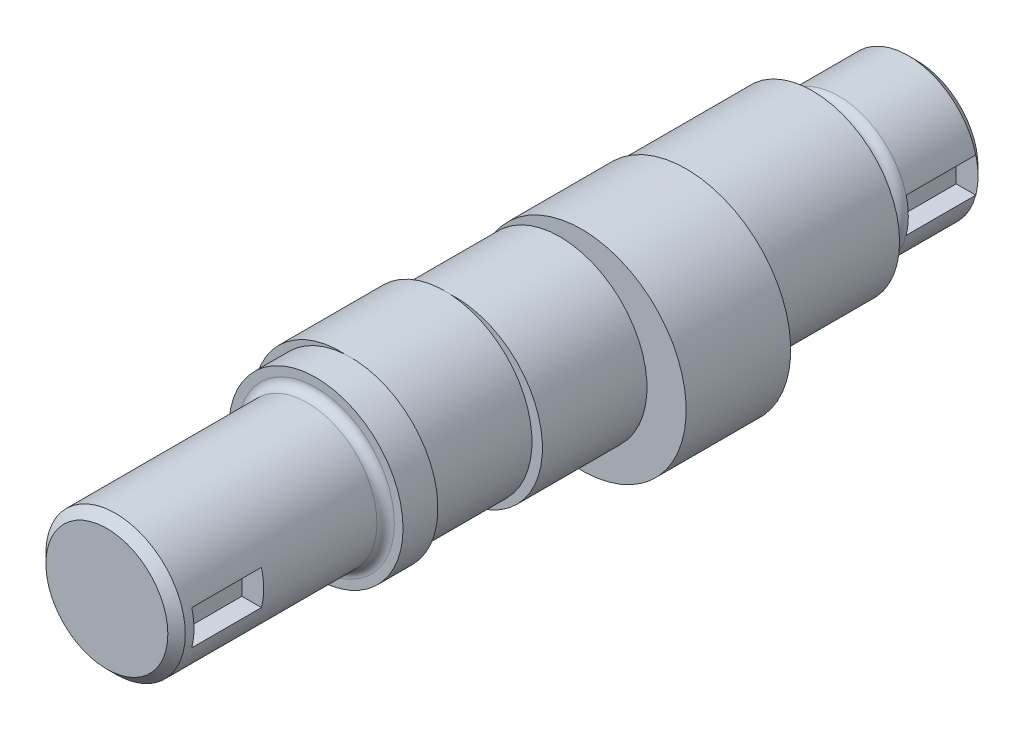
ISO-10303-21;
HEADER;
FILE_DESCRIPTION(('STEP AP214'),'2;1');
FILE_NAME('part.step','',(''),(''),'','','');
FILE_SCHEMA(('AUTOMOTIVE_DESIGN { 1 0 10303 214 1 1 1 1 }'));
ENDSEC;
DATA;
#1=APPLICATION_CONTEXT('core data for automotive mechanical design processes');
#2=APPLICATION_PROTOCOL_DEFINITION('international standard','automotive_design',2000,#1);
#3=PRODUCT_CONTEXT('',#1,'mechanical');
#4=PRODUCT('Part','Part','',(#3));
#5=PRODUCT_RELATED_PRODUCT_CATEGORY('part','',(#4));
#6=PRODUCT_DEFINITION_FORMATION('','',#4);
#7=PRODUCT_DEFINITION_CONTEXT('part definition',#1,'design');
#8=PRODUCT_DEFINITION('design','',#6,#7);
#9=PRODUCT_DEFINITION_SHAPE('','',#8);
#10=(LENGTH_UNIT() NAMED_UNIT(*) SI_UNIT(.MILLI.,.METRE.));
#11=(NAMED_UNIT(*) PLANE_ANGLE_UNIT() SI_UNIT($,.RADIAN.));
#12=(NAMED_UNIT(*) SI_UNIT($,.STERADIAN.) SOLID_ANGLE_UNIT());
#13=UNCERTAINTY_MEASURE_WITH_UNIT(LENGTH_MEASURE(1.E-05),#10,'distance_accuracy_value','');
#14=(GEOMETRIC_REPRESENTATION_CONTEXT(3) GLOBAL_UNCERTAINTY_ASSIGNED_CONTEXT((#13)) GLOBAL_UNIT_ASSIGNED_CONTEXT((#10,
#11,#12)) REPRESENTATION_CONTEXT('',''));
#15=CARTESIAN_POINT('',(0.,0.,0.));
#16=DIRECTION('',(0.,0.,1.));
#17=DIRECTION('',(1.,0.,0.));
#18=AXIS2_PLACEMENT_3D('',#15,#16,#17);
#19=CARTESIAN_POINT('',(0.,0.,80.));
#20=DIRECTION('',(0.,0.,-1.));
#21=DIRECTION('',(-1.,0.,0.));
#22=AXIS2_PLACEMENT_3D('',#19,#20,#21);
#23=CYLINDRICAL_SURFACE('',#22,8.);
#24=CARTESIAN_POINT('',(0.,0.,57.));
#25=DIRECTION('',(0.,0.,1.));
#26=DIRECTION('',(1.,0.,0.));
#27=AXIS2_PLACEMENT_3D('',#24,#25,#26);
#28=CIRCLE('',#27,8.);
#29=CARTESIAN_POINT('',(8.,0.,57.));
#30=VERTEX_POINT('',#29);
#31=EDGE_CURVE('E248',#30,#30,#28,.T.);
#32=ORIENTED_EDGE('',*,*,#31,.T.);
#33=EDGE_LOOP('',(#32));
#34=FACE_BOUND('',#33,.T.);
#35=CARTESIAN_POINT('',(0.,0.,79.));
#36=DIRECTION('',(0.,0.,1.));
#37=DIRECTION('',(1.,0.,0.));
#38=AXIS2_PLACEMENT_3D('',#35,#36,#37);
#39=CIRCLE('',#38,8.);
#40=CARTESIAN_POINT('',(8.,0.,79.));
#41=VERTEX_POINT('',#40);
#42=EDGE_CURVE('E240',#41,#41,#39,.F.);
#43=ORIENTED_EDGE('',*,*,#42,.T.);
#44=EDGE_LOOP('',(#43));
#45=FACE_BOUND('',#44,.T.);
#46=CARTESIAN_POINT('',(0.,0.,78.));
#47=DIRECTION('',(0.,0.,-1.));
#48=DIRECTION('',(-1.,0.,0.));
#49=AXIS2_PLACEMENT_3D('',#46,#47,#48);
#50=CIRCLE('',#49,8.);
#51=CARTESIAN_POINT('',(7.74596669241483,2.,78.));
#52=VERTEX_POINT('',#51);
#53=CARTESIAN_POINT('',(7.74596669241483,-2.,78.));
#54=VERTEX_POINT('',#53);
#55=EDGE_CURVE('E138',#52,#54,#50,.T.);
#56=ORIENTED_EDGE('',*,*,#55,.F.);
#57=DIRECTION('',(0.,0.,-1.));
#58=VECTOR('',#57,1.);
#59=CARTESIAN_POINT('',(7.74596669241483,2.,80.));
#60=LINE('',#59,#58);
#61=CARTESIAN_POINT('',(7.74596669241483,2.,70.));
#62=VERTEX_POINT('',#61);
#63=EDGE_CURVE('E232',#62,#52,#60,.F.);
#64=ORIENTED_EDGE('',*,*,#63,.F.);
#65=CARTESIAN_POINT('',(0.,0.,70.));
#66=DIRECTION('',(0.,0.,-1.));
#67=DIRECTION('',(-1.,0.,0.));
#68=AXIS2_PLACEMENT_3D('',#65,#66,#67);
#69=CIRCLE('',#68,8.);
#70=CARTESIAN_POINT('',(7.74596669241483,-2.,70.));
#71=VERTEX_POINT('',#70);
#72=EDGE_CURVE('E229',#62,#71,#69,.T.);
#73=ORIENTED_EDGE('',*,*,#72,.T.);
#74=DIRECTION('',(0.,0.,-1.));
#75=VECTOR('',#74,1.);
#76=CARTESIAN_POINT('',(7.74596669241483,-2.,80.));
#77=LINE('',#76,#75);
#78=EDGE_CURVE('E234',#54,#71,#77,.T.);
#79=ORIENTED_EDGE('',*,*,#78,.F.);
#80=EDGE_LOOP('',(#56,#64,#73,#79));
#81=FACE_BOUND('',#80,.T.);
#82=ADVANCED_FACE('F43',(#34,#45,#81),#23,.T.);
#83=CARTESIAN_POINT('',(0.,0.,-3.));
#84=DIRECTION('',(0.,0.,-1.));
#85=DIRECTION('',(-1.,0.,0.));
#86=AXIS2_PLACEMENT_3D('',#83,#84,#85);
#87=CYLINDRICAL_SURFACE('',#86,8.);
#88=DIRECTION('',(0.,0.,-1.));
#89=VECTOR('',#88,1.);
#90=CARTESIAN_POINT('',(7.74596669241483,-2.,-3.));
#91=LINE('',#90,#89);
#92=CARTESIAN_POINT('',(7.74596669241483,-2.,-4.));
#93=VERTEX_POINT('',#92);
#94=CARTESIAN_POINT('',(7.74596669241483,-2.,-12.));
#95=VERTEX_POINT('',#94);
#96=EDGE_CURVE('E224',#93,#95,#91,.T.);
#97=ORIENTED_EDGE('',*,*,#96,.F.);
#98=CARTESIAN_POINT('',(0.,0.,-4.));
#99=DIRECTION('',(0.,0.,1.));
#100=DIRECTION('',(1.,0.,0.));
#101=AXIS2_PLACEMENT_3D('',#98,#99,#100);
#102=CIRCLE('',#101,8.);
#103=CARTESIAN_POINT('',(7.74596669241483,2.,-4.));
#104=VERTEX_POINT('',#103);
#105=EDGE_CURVE('E257',#93,#104,#102,.F.);
#106=ORIENTED_EDGE('',*,*,#105,.T.);
#107=DIRECTION('',(0.,0.,-1.));
#108=VECTOR('',#107,1.);
#109=CARTESIAN_POINT('',(7.74596669241483,2.,-3.));
#110=LINE('',#109,#108);
#111=CARTESIAN_POINT('',(7.74596669241483,2.,-12.));
#112=VERTEX_POINT('',#111);
#113=EDGE_CURVE('E221',#112,#104,#110,.F.);
#114=ORIENTED_EDGE('',*,*,#113,.F.);
#115=CARTESIAN_POINT('',(0.,0.,-12.));
#116=DIRECTION('',(0.,0.,1.));
#117=DIRECTION('',(1.,0.,0.));
#118=AXIS2_PLACEMENT_3D('',#115,#116,#117);
#119=CIRCLE('',#118,8.);
#120=EDGE_CURVE('E243',#112,#95,#119,.T.);
#121=ORIENTED_EDGE('',*,*,#120,.T.);
#122=EDGE_LOOP('',(#97,#106,#114,#121));
#123=FACE_BOUND('',#122,.T.);
#124=ADVANCED_FACE('F275',(#123),#87,.T.);
#125=CARTESIAN_POINT('',(0.,0.,-3.));
#126=DIRECTION('',(0.,0.,1.));
#127=DIRECTION('',(1.,0.,0.));
#128=AXIS2_PLACEMENT_3D('',#125,#126,#127);
#129=PLANE('',#128);
#130=CARTESIAN_POINT('',(0.,0.,-3.));
#131=DIRECTION('',(0.,0.,1.));
#132=DIRECTION('',(1.,0.,0.));
#133=AXIS2_PLACEMENT_3D('',#130,#131,#132);
#134=CIRCLE('',#133,7.);
#135=CARTESIAN_POINT('',(7.,0.,-3.));
#136=VERTEX_POINT('',#135);
#137=EDGE_CURVE('E254',#136,#136,#134,.T.);
#138=ORIENTED_EDGE('',*,*,#137,.T.);
#139=EDGE_LOOP('',(#138));
#140=FACE_BOUND('',#139,.T.);
#141=CARTESIAN_POINT('',(0.,0.,-3.));
#142=DIRECTION('',(0.,0.,1.));
#143=DIRECTION('',(1.,0.,0.));
#144=AXIS2_PLACEMENT_3D('',#141,#142,#143);
#145=CIRCLE('',#144,6.5);
#146=CARTESIAN_POINT('',(6.5,0.,-3.));
#147=VERTEX_POINT('',#146);
#148=EDGE_CURVE('E214',#147,#147,#145,.T.);
#149=ORIENTED_EDGE('',*,*,#148,.F.);
#150=EDGE_LOOP('',(#149));
#151=FACE_BOUND('',#150,.T.);
#152=ADVANCED_FACE('F282',(#140,#151),#129,.T.);
#153=CARTESIAN_POINT('',(0.,0.,-13.));
#154=DIRECTION('',(0.,0.,1.));
#155=DIRECTION('',(1.,0.,0.));
#156=AXIS2_PLACEMENT_3D('',#153,#154,#155);
#157=PLANE('',#156);
#158=CARTESIAN_POINT('',(0.,0.,-13.));
#159=DIRECTION('',(0.,0.,1.));
#160=DIRECTION('',(1.,0.,0.));
#161=AXIS2_PLACEMENT_3D('',#158,#159,#160);
#162=CIRCLE('',#161,7.00000000000001);
#163=CARTESIAN_POINT('',(7.00000000000001,0.,-13.));
#164=VERTEX_POINT('',#163);
#165=EDGE_CURVE('E245',#164,#164,#162,.F.);
#166=ORIENTED_EDGE('',*,*,#165,.T.);
#167=EDGE_LOOP('',(#166));
#168=FACE_BOUND('',#167,.T.);
#169=ADVANCED_FACE('F351',(#168),#157,.F.);
#170=CARTESIAN_POINT('',(0.,0.,-1.));
#171=DIRECTION('',(0.,0.,-1.));
#172=DIRECTION('',(-1.,0.,0.));
#173=AXIS2_PLACEMENT_3D('',#170,#171,#172);
#174=CYLINDRICAL_SURFACE('',#173,6.5);
#175=CARTESIAN_POINT('',(0.,0.,-2.));
#176=DIRECTION('',(0.,0.,1.));
#177=DIRECTION('',(1.,0.,0.));
#178=AXIS2_PLACEMENT_3D('',#175,#176,#177);
#179=CIRCLE('',#178,6.5);
#180=CARTESIAN_POINT('',(6.5,0.,-2.));
#181=VERTEX_POINT('',#180);
#182=EDGE_CURVE('E11',#181,#181,#179,.F.);
#183=ORIENTED_EDGE('',*,*,#182,.T.);
#184=EDGE_LOOP('',(#183));
#185=FACE_BOUND('',#184,.T.);
#186=ORIENTED_EDGE('',*,*,#148,.T.);
#187=EDGE_LOOP('',(#186));
#188=FACE_BOUND('',#187,.T.);
#189=ADVANCED_FACE('F347',(#185,#188),#174,.T.);
#190=CARTESIAN_POINT('',(0.,0.,16.));
#191=DIRECTION('',(0.,0.,-1.));
#192=DIRECTION('',(-1.,0.,0.));
#193=AXIS2_PLACEMENT_3D('',#190,#191,#192);
#194=CYLINDRICAL_SURFACE('',#193,10.);
#195=CARTESIAN_POINT('',(0.,0.,16.));
#196=DIRECTION('',(0.,0.,1.));
#197=DIRECTION('',(1.,0.,0.));
#198=AXIS2_PLACEMENT_3D('',#195,#196,#197);
#199=CIRCLE('',#198,10.);
#200=CARTESIAN_POINT('',(-7.55,6.55724789831832,16.));
#201=VERTEX_POINT('',#200);
#202=CARTESIAN_POINT('',(-7.55,-6.55724789831832,16.));
#203=VERTEX_POINT('',#202);
#204=EDGE_CURVE('E212',#201,#203,#199,.T.);
#205=ORIENTED_EDGE('',*,*,#204,.F.);
#206=EDGE_CURVE('E215',#203,#201,#199,.T.);
#207=ORIENTED_EDGE('',*,*,#206,.F.);
#208=EDGE_LOOP('',(#205,#207));
#209=FACE_BOUND('',#208,.T.);
#210=CARTESIAN_POINT('',(0.,0.,-1.));
#211=DIRECTION('',(0.,0.,1.));
#212=DIRECTION('',(1.,0.,0.));
#213=AXIS2_PLACEMENT_3D('',#210,#211,#212);
#214=CIRCLE('',#213,10.);
#215=CARTESIAN_POINT('',(10.,0.,-1.));
#216=VERTEX_POINT('',#215);
#217=EDGE_CURVE('E207',#216,#216,#214,.T.);
#218=ORIENTED_EDGE('',*,*,#217,.T.);
#219=EDGE_LOOP('',(#218));
#220=FACE_BOUND('',#219,.T.);
#221=ADVANCED_FACE('F341',(#209,#220),#194,.T.);
#222=CARTESIAN_POINT('',(0.,0.,16.));
#223=DIRECTION('',(0.,0.,1.));
#224=DIRECTION('',(1.,0.,0.));
#225=AXIS2_PLACEMENT_3D('',#222,#223,#224);
#226=PLANE('',#225);
#227=CARTESIAN_POINT('',(2.5,0.,16.));
#228=DIRECTION('',(0.,0.,1.));
#229=DIRECTION('',(1.,0.,0.));
#230=AXIS2_PLACEMENT_3D('',#227,#228,#229);
#231=CIRCLE('',#230,12.);
#232=EDGE_CURVE('E209',#201,#203,#231,.T.);
#233=ORIENTED_EDGE('',*,*,#232,.F.);
#234=ORIENTED_EDGE('',*,*,#204,.T.);
#235=EDGE_LOOP('',(#233,#234));
#236=FACE_BOUND('',#235,.T.);
#237=ADVANCED_FACE('F338',(#236),#226,.T.);
#238=CARTESIAN_POINT('',(0.,0.,-1.));
#239=DIRECTION('',(0.,0.,1.));
#240=DIRECTION('',(1.,0.,0.));
#241=AXIS2_PLACEMENT_3D('',#238,#239,#240);
#242=PLANE('',#241);
#243=CARTESIAN_POINT('',(0.,0.,-1.));
#244=DIRECTION('',(0.,0.,1.));
#245=DIRECTION('',(1.,0.,0.));
#246=AXIS2_PLACEMENT_3D('',#243,#244,#245);
#247=CIRCLE('',#246,7.5);
#248=CARTESIAN_POINT('',(7.5,0.,-1.));
#249=VERTEX_POINT('',#248);
#250=EDGE_CURVE('E51',#249,#249,#247,.T.);
#251=ORIENTED_EDGE('',*,*,#250,.T.);
#252=EDGE_LOOP('',(#251));
#253=FACE_BOUND('',#252,.T.);
#254=ORIENTED_EDGE('',*,*,#217,.F.);
#255=EDGE_LOOP('',(#254));
#256=FACE_BOUND('',#255,.T.);
#257=ADVANCED_FACE('F262',(#253,#256),#242,.F.);
#258=CARTESIAN_POINT('',(2.5,0.,16.));
#259=DIRECTION('',(0.,0.,1.));
#260=DIRECTION('',(1.,0.,0.));
#261=AXIS2_PLACEMENT_3D('',#258,#259,#260);
#262=PLANE('',#261);
#263=EDGE_CURVE('E199',#203,#201,#231,.T.);
#264=ORIENTED_EDGE('',*,*,#263,.F.);
#265=ORIENTED_EDGE('',*,*,#206,.T.);
#266=EDGE_LOOP('',(#264,#265));
#267=FACE_BOUND('',#266,.T.);
#268=ADVANCED_FACE('F331',(#267),#262,.F.);
#269=CARTESIAN_POINT('',(2.5,0.,28.));
#270=DIRECTION('',(0.,0.,-1.));
#271=DIRECTION('',(-1.,0.,0.));
#272=AXIS2_PLACEMENT_3D('',#269,#270,#271);
#273=CYLINDRICAL_SURFACE('',#272,12.);
#274=CARTESIAN_POINT('',(2.5,0.,28.));
#275=DIRECTION('',(0.,0.,1.));
#276=DIRECTION('',(1.,0.,0.));
#277=AXIS2_PLACEMENT_3D('',#274,#275,#276);
#278=CIRCLE('',#277,12.);
#279=CARTESIAN_POINT('',(-7.55,6.55724789831832,28.));
#280=VERTEX_POINT('',#279);
#281=CARTESIAN_POINT('',(-7.55,-6.55724789831832,28.));
#282=VERTEX_POINT('',#281);
#283=EDGE_CURVE('E204',#280,#282,#278,.T.);
#284=ORIENTED_EDGE('',*,*,#283,.F.);
#285=EDGE_CURVE('E208',#282,#280,#278,.T.);
#286=ORIENTED_EDGE('',*,*,#285,.F.);
#287=EDGE_LOOP('',(#284,#286));
#288=FACE_BOUND('',#287,.T.);
#289=ORIENTED_EDGE('',*,*,#232,.T.);
#290=ORIENTED_EDGE('',*,*,#263,.T.);
#291=EDGE_LOOP('',(#289,#290));
#292=FACE_BOUND('',#291,.T.);
#293=ADVANCED_FACE('F329',(#288,#292),#273,.T.);
#294=CARTESIAN_POINT('',(2.5,0.,28.));
#295=DIRECTION('',(0.,0.,1.));
#296=DIRECTION('',(1.,0.,0.));
#297=AXIS2_PLACEMENT_3D('',#294,#295,#296);
#298=PLANE('',#297);
#299=CARTESIAN_POINT('',(0.,0.,28.));
#300=DIRECTION('',(0.,0.,1.));
#301=DIRECTION('',(1.,0.,0.));
#302=AXIS2_PLACEMENT_3D('',#299,#300,#301);
#303=CIRCLE('',#302,10.);
#304=EDGE_CURVE('E203',#282,#280,#303,.T.);
#305=ORIENTED_EDGE('',*,*,#304,.F.);
#306=ORIENTED_EDGE('',*,*,#285,.T.);
#307=EDGE_LOOP('',(#305,#306));
#308=FACE_BOUND('',#307,.T.);
#309=ADVANCED_FACE('F322',(#308),#298,.T.);
#310=CARTESIAN_POINT('',(0.,0.,28.));
#311=DIRECTION('',(0.,0.,1.));
#312=DIRECTION('',(1.,0.,0.));
#313=AXIS2_PLACEMENT_3D('',#310,#311,#312);
#314=PLANE('',#313);
#315=EDGE_CURVE('E191',#280,#282,#303,.T.);
#316=ORIENTED_EDGE('',*,*,#315,.F.);
#317=ORIENTED_EDGE('',*,*,#283,.T.);
#318=EDGE_LOOP('',(#316,#317));
#319=FACE_BOUND('',#318,.T.);
#320=ADVANCED_FACE('F319',(#319),#314,.F.);
#321=CARTESIAN_POINT('',(0.,0.,40.));
#322=DIRECTION('',(0.,0.,-1.));
#323=DIRECTION('',(-1.,0.,0.));
#324=AXIS2_PLACEMENT_3D('',#321,#322,#323);
#325=CYLINDRICAL_SURFACE('',#324,10.);
#326=CARTESIAN_POINT('',(0.,0.,40.));
#327=DIRECTION('',(0.,0.,1.));
#328=DIRECTION('',(1.,0.,0.));
#329=AXIS2_PLACEMENT_3D('',#326,#327,#328);
#330=CIRCLE('',#329,10.);
#331=CARTESIAN_POINT('',(-0.6,9.98198377077422,40.));
#332=VERTEX_POINT('',#331);
#333=CARTESIAN_POINT('',(-0.6,-9.98198377077422,40.));
#334=VERTEX_POINT('',#333);
#335=EDGE_CURVE('E196',#332,#334,#330,.T.);
#336=ORIENTED_EDGE('',*,*,#335,.F.);
#337=EDGE_CURVE('E200',#334,#332,#330,.T.);
#338=ORIENTED_EDGE('',*,*,#337,.F.);
#339=EDGE_LOOP('',(#336,#338));
#340=FACE_BOUND('',#339,.T.);
#341=ORIENTED_EDGE('',*,*,#315,.T.);
#342=ORIENTED_EDGE('',*,*,#304,.T.);
#343=EDGE_LOOP('',(#341,#342));
#344=FACE_BOUND('',#343,.T.);
#345=ADVANCED_FACE('F317',(#340,#344),#325,.T.);
#346=CARTESIAN_POINT('',(0.,0.,40.));
#347=DIRECTION('',(0.,0.,1.));
#348=DIRECTION('',(1.,0.,0.));
#349=AXIS2_PLACEMENT_3D('',#346,#347,#348);
#350=PLANE('',#349);
#351=CARTESIAN_POINT('',(-1.2,0.,40.));
#352=DIRECTION('',(0.,0.,1.));
#353=DIRECTION('',(1.,0.,0.));
#354=AXIS2_PLACEMENT_3D('',#351,#352,#353);
#355=CIRCLE('',#354,10.);
#356=EDGE_CURVE('E195',#334,#332,#355,.T.);
#357=ORIENTED_EDGE('',*,*,#356,.F.);
#358=ORIENTED_EDGE('',*,*,#337,.T.);
#359=EDGE_LOOP('',(#357,#358));
#360=FACE_BOUND('',#359,.T.);
#361=ADVANCED_FACE('F310',(#360),#350,.T.);
#362=CARTESIAN_POINT('',(-1.2,0.,40.));
#363=DIRECTION('',(0.,0.,1.));
#364=DIRECTION('',(1.,0.,0.));
#365=AXIS2_PLACEMENT_3D('',#362,#363,#364);
#366=PLANE('',#365);
#367=EDGE_CURVE('E185',#332,#334,#355,.T.);
#368=ORIENTED_EDGE('',*,*,#367,.F.);
#369=ORIENTED_EDGE('',*,*,#335,.T.);
#370=EDGE_LOOP('',(#368,#369));
#371=FACE_BOUND('',#370,.T.);
#372=ADVANCED_FACE('F307',(#371),#366,.F.);
#373=CARTESIAN_POINT('',(-1.2,0.,52.));
#374=DIRECTION('',(0.,0.,-1.));
#375=DIRECTION('',(-1.,0.,0.));
#376=AXIS2_PLACEMENT_3D('',#373,#374,#375);
#377=CYLINDRICAL_SURFACE('',#376,10.);
#378=CARTESIAN_POINT('',(-1.2,0.,52.));
#379=DIRECTION('',(0.,0.,1.));
#380=DIRECTION('',(1.,0.,0.));
#381=AXIS2_PLACEMENT_3D('',#378,#379,#380);
#382=CIRCLE('',#381,10.);
#383=CARTESIAN_POINT('',(-0.6,9.98198377077422,52.));
#384=VERTEX_POINT('',#383);
#385=CARTESIAN_POINT('',(-0.6,-9.98198377077422,52.));
#386=VERTEX_POINT('',#385);
#387=EDGE_CURVE('E189',#384,#386,#382,.T.);
#388=ORIENTED_EDGE('',*,*,#387,.F.);
#389=EDGE_CURVE('E192',#386,#384,#382,.T.);
#390=ORIENTED_EDGE('',*,*,#389,.F.);
#391=EDGE_LOOP('',(#388,#390));
#392=FACE_BOUND('',#391,.T.);
#393=ORIENTED_EDGE('',*,*,#367,.T.);
#394=ORIENTED_EDGE('',*,*,#356,.T.);
#395=EDGE_LOOP('',(#393,#394));
#396=FACE_BOUND('',#395,.T.);
#397=ADVANCED_FACE('F305',(#392,#396),#377,.T.);
#398=CARTESIAN_POINT('',(-1.2,0.,52.));
#399=DIRECTION('',(0.,0.,1.));
#400=DIRECTION('',(1.,0.,0.));
#401=AXIS2_PLACEMENT_3D('',#398,#399,#400);
#402=PLANE('',#401);
#403=CARTESIAN_POINT('',(0.,0.,52.));
#404=DIRECTION('',(0.,0.,1.));
#405=DIRECTION('',(1.,0.,0.));
#406=AXIS2_PLACEMENT_3D('',#403,#404,#405);
#407=CIRCLE('',#406,10.);
#408=EDGE_CURVE('E186',#384,#386,#407,.T.);
#409=ORIENTED_EDGE('',*,*,#408,.F.);
#410=ORIENTED_EDGE('',*,*,#387,.T.);
#411=EDGE_LOOP('',(#409,#410));
#412=FACE_BOUND('',#411,.T.);
#413=ADVANCED_FACE('F298',(#412),#402,.T.);
#414=CARTESIAN_POINT('',(0.,0.,52.));
#415=DIRECTION('',(0.,0.,1.));
#416=DIRECTION('',(1.,0.,0.));
#417=AXIS2_PLACEMENT_3D('',#414,#415,#416);
#418=PLANE('',#417);
#419=EDGE_CURVE('E181',#386,#384,#407,.T.);
#420=ORIENTED_EDGE('',*,*,#419,.F.);
#421=ORIENTED_EDGE('',*,*,#389,.T.);
#422=EDGE_LOOP('',(#420,#421));
#423=FACE_BOUND('',#422,.T.);
#424=ADVANCED_FACE('F295',(#423),#418,.F.);
#425=CARTESIAN_POINT('',(0.,0.,56.));
#426=DIRECTION('',(0.,0.,-1.));
#427=DIRECTION('',(-1.,0.,0.));
#428=AXIS2_PLACEMENT_3D('',#425,#426,#427);
#429=CYLINDRICAL_SURFACE('',#428,10.);
#430=CARTESIAN_POINT('',(0.,0.,56.));
#431=DIRECTION('',(0.,0.,1.));
#432=DIRECTION('',(1.,0.,0.));
#433=AXIS2_PLACEMENT_3D('',#430,#431,#432);
#434=CIRCLE('',#433,10.);
#435=CARTESIAN_POINT('',(10.,0.,56.));
#436=VERTEX_POINT('',#435);
#437=EDGE_CURVE('E182',#436,#436,#434,.T.);
#438=ORIENTED_EDGE('',*,*,#437,.F.);
#439=EDGE_LOOP('',(#438));
#440=FACE_BOUND('',#439,.T.);
#441=ORIENTED_EDGE('',*,*,#408,.T.);
#442=ORIENTED_EDGE('',*,*,#419,.T.);
#443=EDGE_LOOP('',(#441,#442));
#444=FACE_BOUND('',#443,.T.);
#445=ADVANCED_FACE('F293',(#440,#444),#429,.T.);
#446=CARTESIAN_POINT('',(0.,0.,56.));
#447=DIRECTION('',(0.,0.,1.));
#448=DIRECTION('',(1.,0.,0.));
#449=AXIS2_PLACEMENT_3D('',#446,#447,#448);
#450=PLANE('',#449);
#451=CARTESIAN_POINT('',(0.,0.,56.));
#452=DIRECTION('',(0.,0.,1.));
#453=DIRECTION('',(1.,0.,0.));
#454=AXIS2_PLACEMENT_3D('',#451,#452,#453);
#455=CIRCLE('',#454,9.);
#456=CARTESIAN_POINT('',(9.,0.,56.));
#457=VERTEX_POINT('',#456);
#458=EDGE_CURVE('E251',#457,#457,#455,.F.);
#459=ORIENTED_EDGE('',*,*,#458,.T.);
#460=EDGE_LOOP('',(#459));
#461=FACE_BOUND('',#460,.T.);
#462=ORIENTED_EDGE('',*,*,#437,.T.);
#463=EDGE_LOOP('',(#462));
#464=FACE_BOUND('',#463,.T.);
#465=ADVANCED_FACE('F290',(#461,#464),#450,.T.);
#466=CARTESIAN_POINT('',(0.,0.,80.));
#467=DIRECTION('',(0.,0.,1.));
#468=DIRECTION('',(1.,0.,0.));
#469=AXIS2_PLACEMENT_3D('',#466,#467,#468);
#470=PLANE('',#469);
#471=CARTESIAN_POINT('',(0.,0.,80.));
#472=DIRECTION('',(0.,0.,1.));
#473=DIRECTION('',(1.,0.,0.));
#474=AXIS2_PLACEMENT_3D('',#471,#472,#473);
#475=CIRCLE('',#474,6.99999999999999);
#476=CARTESIAN_POINT('',(6.99999999999999,0.,80.));
#477=VERTEX_POINT('',#476);
#478=EDGE_CURVE('E237',#477,#477,#475,.T.);
#479=ORIENTED_EDGE('',*,*,#478,.T.);
#480=EDGE_LOOP('',(#479));
#481=FACE_BOUND('',#480,.T.);
#482=ADVANCED_FACE('F288',(#481),#470,.T.);
#483=CARTESIAN_POINT('',(5.5,-2.,-4.));
#484=DIRECTION('',(0.,1.,0.));
#485=DIRECTION('',(0.,0.,1.));
#486=AXIS2_PLACEMENT_3D('',#483,#484,#485);
#487=PLANE('',#486);
#488=ORIENTED_EDGE('',*,*,#96,.T.);
#489=DIRECTION('',(1.,0.,0.));
#490=VECTOR('',#489,1.);
#491=CARTESIAN_POINT('',(5.5,-2.,-12.));
#492=LINE('',#491,#490);
#493=CARTESIAN_POINT('',(5.5,-2.,-12.));
#494=VERTEX_POINT('',#493);
#495=EDGE_CURVE('E158',#494,#95,#492,.T.);
#496=ORIENTED_EDGE('',*,*,#495,.F.);
#497=DIRECTION('',(0.,0.,-1.));
#498=VECTOR('',#497,1.);
#499=CARTESIAN_POINT('',(5.5,-2.,-4.));
#500=LINE('',#499,#498);
#501=CARTESIAN_POINT('',(5.5,-2.,-4.));
#502=VERTEX_POINT('',#501);
#503=EDGE_CURVE('E178',#502,#494,#500,.T.);
#504=ORIENTED_EDGE('',*,*,#503,.F.);
#505=DIRECTION('',(1.,0.,0.));
#506=VECTOR('',#505,1.);
#507=CARTESIAN_POINT('',(5.5,-2.,-4.));
#508=LINE('',#507,#506);
#509=EDGE_CURVE('E166',#502,#93,#508,.T.);
#510=ORIENTED_EDGE('',*,*,#509,.T.);
#511=EDGE_LOOP('',(#488,#496,#504,#510));
#512=FACE_BOUND('',#511,.T.);
#513=ADVANCED_FACE('F504',(#512),#487,.T.);
#514=CARTESIAN_POINT('',(5.5,2.,-4.));
#515=DIRECTION('',(0.,-1.,0.));
#516=DIRECTION('',(0.,0.,-1.));
#517=AXIS2_PLACEMENT_3D('',#514,#515,#516);
#518=PLANE('',#517);
#519=ORIENTED_EDGE('',*,*,#113,.T.);
#520=DIRECTION('',(-1.,0.,0.));
#521=VECTOR('',#520,1.);
#522=CARTESIAN_POINT('',(5.5,2.,-4.));
#523=LINE('',#522,#521);
#524=CARTESIAN_POINT('',(5.5,2.,-4.));
#525=VERTEX_POINT('',#524);
#526=EDGE_CURVE('E170',#104,#525,#523,.T.);
#527=ORIENTED_EDGE('',*,*,#526,.T.);
#528=DIRECTION('',(0.,0.,-1.));
#529=VECTOR('',#528,1.);
#530=CARTESIAN_POINT('',(5.5,2.,-4.));
#531=LINE('',#530,#529);
#532=CARTESIAN_POINT('',(5.5,2.,-12.));
#533=VERTEX_POINT('',#532);
#534=EDGE_CURVE('E171',#525,#533,#531,.T.);
#535=ORIENTED_EDGE('',*,*,#534,.T.);
#536=DIRECTION('',(-1.,0.,0.));
#537=VECTOR('',#536,1.);
#538=CARTESIAN_POINT('',(5.5,2.,-12.));
#539=LINE('',#538,#537);
#540=EDGE_CURVE('E167',#112,#533,#539,.T.);
#541=ORIENTED_EDGE('',*,*,#540,.F.);
#542=EDGE_LOOP('',(#519,#527,#535,#541));
#543=FACE_BOUND('',#542,.T.);
#544=ADVANCED_FACE('F496',(#543),#518,.T.);
#545=CARTESIAN_POINT('',(0.,0.,-4.));
#546=DIRECTION('',(0.,0.,-1.));
#547=DIRECTION('',(-1.,0.,0.));
#548=AXIS2_PLACEMENT_3D('',#545,#546,#547);
#549=PLANE('',#548);
#550=CARTESIAN_POINT('',(0.,0.,-4.));
#551=DIRECTION('',(0.,0.,-1.));
#552=DIRECTION('',(-1.,0.,0.));
#553=AXIS2_PLACEMENT_3D('',#550,#551,#552);
#554=CIRCLE('',#553,8.);
#555=EDGE_CURVE('E227',#104,#93,#554,.T.);
#556=ORIENTED_EDGE('',*,*,#555,.T.);
#557=ORIENTED_EDGE('',*,*,#509,.F.);
#558=DIRECTION('',(0.,-1.,0.));
#559=VECTOR('',#558,1.);
#560=CARTESIAN_POINT('',(5.5,-2.,-4.));
#561=LINE('',#560,#559);
#562=EDGE_CURVE('E163',#525,#502,#561,.T.);
#563=ORIENTED_EDGE('',*,*,#562,.F.);
#564=ORIENTED_EDGE('',*,*,#526,.F.);
#565=EDGE_LOOP('',(#556,#557,#563,#564));
#566=FACE_BOUND('',#565,.T.);
#567=ADVANCED_FACE('F411',(#566),#549,.T.);
#568=CARTESIAN_POINT('',(0.,0.,-12.));
#569=DIRECTION('',(0.,0.,-1.));
#570=DIRECTION('',(-1.,0.,0.));
#571=AXIS2_PLACEMENT_3D('',#568,#569,#570);
#572=PLANE('',#571);
#573=ORIENTED_EDGE('',*,*,#540,.T.);
#574=DIRECTION('',(0.,-1.,0.));
#575=VECTOR('',#574,1.);
#576=CARTESIAN_POINT('',(5.5,-2.,-12.));
#577=LINE('',#576,#575);
#578=EDGE_CURVE('E155',#533,#494,#577,.T.);
#579=ORIENTED_EDGE('',*,*,#578,.T.);
#580=ORIENTED_EDGE('',*,*,#495,.T.);
#581=CARTESIAN_POINT('',(0.,0.,-12.));
#582=DIRECTION('',(0.,0.,-1.));
#583=DIRECTION('',(-1.,0.,0.));
#584=AXIS2_PLACEMENT_3D('',#581,#582,#583);
#585=CIRCLE('',#584,8.);
#586=EDGE_CURVE('E65',#112,#95,#585,.T.);
#587=ORIENTED_EDGE('',*,*,#586,.F.);
#588=EDGE_LOOP('',(#573,#579,#580,#587));
#589=FACE_BOUND('',#588,.T.);
#590=ADVANCED_FACE('F482',(#589),#572,.F.);
#591=CARTESIAN_POINT('',(5.5,-2.,-4.));
#592=DIRECTION('',(1.,0.,0.));
#593=DIRECTION('',(0.,0.,-1.));
#594=AXIS2_PLACEMENT_3D('',#591,#592,#593);
#595=PLANE('',#594);
#596=ORIENTED_EDGE('',*,*,#578,.F.);
#597=ORIENTED_EDGE('',*,*,#534,.F.);
#598=ORIENTED_EDGE('',*,*,#562,.T.);
#599=ORIENTED_EDGE('',*,*,#503,.T.);
#600=EDGE_LOOP('',(#596,#597,#598,#599));
#601=FACE_BOUND('',#600,.T.);
#602=ADVANCED_FACE('F469',(#601),#595,.T.);
#603=CARTESIAN_POINT('',(5.5,-2.,78.));
#604=DIRECTION('',(0.,1.,0.));
#605=DIRECTION('',(0.,0.,1.));
#606=AXIS2_PLACEMENT_3D('',#603,#604,#605);
#607=PLANE('',#606);
#608=ORIENTED_EDGE('',*,*,#78,.T.);
#609=DIRECTION('',(1.,0.,0.));
#610=VECTOR('',#609,1.);
#611=CARTESIAN_POINT('',(5.5,-2.,70.));
#612=LINE('',#611,#610);
#613=CARTESIAN_POINT('',(5.5,-2.,70.));
#614=VERTEX_POINT('',#613);
#615=EDGE_CURVE('E58',#614,#71,#612,.T.);
#616=ORIENTED_EDGE('',*,*,#615,.F.);
#617=DIRECTION('',(0.,0.,-1.));
#618=VECTOR('',#617,1.);
#619=CARTESIAN_POINT('',(5.5,-2.,78.));
#620=LINE('',#619,#618);
#621=CARTESIAN_POINT('',(5.5,-2.,78.));
#622=VERTEX_POINT('',#621);
#623=EDGE_CURVE('E149',#622,#614,#620,.T.);
#624=ORIENTED_EDGE('',*,*,#623,.F.);
#625=DIRECTION('',(1.,0.,0.));
#626=VECTOR('',#625,1.);
#627=CARTESIAN_POINT('',(5.5,-2.,78.));
#628=LINE('',#627,#626);
#629=EDGE_CURVE('E132',#622,#54,#628,.T.);
#630=ORIENTED_EDGE('',*,*,#629,.T.);
#631=EDGE_LOOP('',(#608,#616,#624,#630));
#632=FACE_BOUND('',#631,.T.);
#633=ADVANCED_FACE('F154',(#632),#607,.T.);
#634=CARTESIAN_POINT('',(5.5,2.,78.));
#635=DIRECTION('',(0.,-1.,0.));
#636=DIRECTION('',(0.,0.,-1.));
#637=AXIS2_PLACEMENT_3D('',#634,#635,#636);
#638=PLANE('',#637);
#639=ORIENTED_EDGE('',*,*,#63,.T.);
#640=DIRECTION('',(-1.,0.,0.));
#641=VECTOR('',#640,1.);
#642=CARTESIAN_POINT('',(5.5,2.,78.));
#643=LINE('',#642,#641);
#644=CARTESIAN_POINT('',(5.5,2.,78.));
#645=VERTEX_POINT('',#644);
#646=EDGE_CURVE('E142',#52,#645,#643,.T.);
#647=ORIENTED_EDGE('',*,*,#646,.T.);
#648=DIRECTION('',(0.,0.,-1.));
#649=VECTOR('',#648,1.);
#650=CARTESIAN_POINT('',(5.5,2.,78.));
#651=LINE('',#650,#649);
#652=CARTESIAN_POINT('',(5.5,2.,70.));
#653=VERTEX_POINT('',#652);
#654=EDGE_CURVE('E151',#645,#653,#651,.T.);
#655=ORIENTED_EDGE('',*,*,#654,.T.);
#656=DIRECTION('',(-1.,0.,0.));
#657=VECTOR('',#656,1.);
#658=CARTESIAN_POINT('',(5.5,2.,70.));
#659=LINE('',#658,#657);
#660=EDGE_CURVE('E152',#62,#653,#659,.T.);
#661=ORIENTED_EDGE('',*,*,#660,.F.);
#662=EDGE_LOOP('',(#639,#647,#655,#661));
#663=FACE_BOUND('',#662,.T.);
#664=ADVANCED_FACE('F454',(#663),#638,.T.);
#665=CARTESIAN_POINT('',(0.,0.,78.));
#666=DIRECTION('',(0.,0.,-1.));
#667=DIRECTION('',(-1.,0.,0.));
#668=AXIS2_PLACEMENT_3D('',#665,#666,#667);
#669=PLANE('',#668);
#670=ORIENTED_EDGE('',*,*,#55,.T.);
#671=ORIENTED_EDGE('',*,*,#629,.F.);
#672=DIRECTION('',(0.,-1.,0.));
#673=VECTOR('',#672,1.);
#674=CARTESIAN_POINT('',(5.5,-2.,78.));
#675=LINE('',#674,#673);
#676=EDGE_CURVE('E136',#645,#622,#675,.T.);
#677=ORIENTED_EDGE('',*,*,#676,.F.);
#678=ORIENTED_EDGE('',*,*,#646,.F.);
#679=EDGE_LOOP('',(#670,#671,#677,#678));
#680=FACE_BOUND('',#679,.T.);
#681=ADVANCED_FACE('F134',(#680),#669,.T.);
#682=CARTESIAN_POINT('',(0.,0.,70.));
#683=DIRECTION('',(0.,0.,-1.));
#684=DIRECTION('',(-1.,0.,0.));
#685=AXIS2_PLACEMENT_3D('',#682,#683,#684);
#686=PLANE('',#685);
#687=ORIENTED_EDGE('',*,*,#660,.T.);
#688=DIRECTION('',(0.,-1.,0.));
#689=VECTOR('',#688,1.);
#690=CARTESIAN_POINT('',(5.5,-2.,70.));
#691=LINE('',#690,#689);
#692=EDGE_CURVE('E669',#653,#614,#691,.T.);
#693=ORIENTED_EDGE('',*,*,#692,.T.);
#694=ORIENTED_EDGE('',*,*,#615,.T.);
#695=ORIENTED_EDGE('',*,*,#72,.F.);
#696=EDGE_LOOP('',(#687,#693,#694,#695));
#697=FACE_BOUND('',#696,.T.);
#698=ADVANCED_FACE('F439',(#697),#686,.F.);
#699=CARTESIAN_POINT('',(5.5,-2.,78.));
#700=DIRECTION('',(1.,0.,0.));
#701=DIRECTION('',(0.,0.,-1.));
#702=AXIS2_PLACEMENT_3D('',#699,#700,#701);
#703=PLANE('',#702);
#704=ORIENTED_EDGE('',*,*,#692,.F.);
#705=ORIENTED_EDGE('',*,*,#654,.F.);
#706=ORIENTED_EDGE('',*,*,#676,.T.);
#707=ORIENTED_EDGE('',*,*,#623,.T.);
#708=EDGE_LOOP('',(#704,#705,#706,#707));
#709=FACE_BOUND('',#708,.T.);
#710=ADVANCED_FACE('F148',(#709),#703,.T.);
#711=CARTESIAN_POINT('',(0.,0.,80.));
#712=DIRECTION('',(0.,0.,-1.));
#713=DIRECTION('',(-1.,0.,0.));
#714=AXIS2_PLACEMENT_3D('',#711,#712,#713);
#715=CONICAL_SURFACE('',#714,6.99999999999999,0.785398163397445);
#716=ORIENTED_EDGE('',*,*,#42,.F.);
#717=EDGE_LOOP('',(#716));
#718=FACE_BOUND('',#717,.T.);
#719=ORIENTED_EDGE('',*,*,#478,.F.);
#720=EDGE_LOOP('',(#719));
#721=FACE_BOUND('',#720,.T.);
#722=ADVANCED_FACE('F360',(#718,#721),#715,.T.);
#723=CARTESIAN_POINT('',(0.,0.,-12.));
#724=DIRECTION('',(0.,0.,1.));
#725=DIRECTION('',(1.,0.,0.));
#726=AXIS2_PLACEMENT_3D('',#723,#724,#725);
#727=CONICAL_SURFACE('',#726,8.,0.785398163397455);
#728=ORIENTED_EDGE('',*,*,#165,.F.);
#729=EDGE_LOOP('',(#728));
#730=FACE_BOUND('',#729,.T.);
#731=ORIENTED_EDGE('',*,*,#586,.T.);
#732=ORIENTED_EDGE('',*,*,#120,.F.);
#733=EDGE_LOOP('',(#731,#732));
#734=FACE_BOUND('',#733,.T.);
#735=ADVANCED_FACE('F366',(#730,#734),#727,.T.);
#736=CARTESIAN_POINT('',(0.,0.,57.));
#737=DIRECTION('',(0.,0.,1.));
#738=DIRECTION('',(1.,0.,0.));
#739=AXIS2_PLACEMENT_3D('',#736,#737,#738);
#740=TOROIDAL_SURFACE('',#739,9.,1.);
#741=ORIENTED_EDGE('',*,*,#458,.F.);
#742=EDGE_LOOP('',(#741));
#743=FACE_BOUND('',#742,.T.);
#744=ORIENTED_EDGE('',*,*,#31,.F.);
#745=EDGE_LOOP('',(#744));
#746=FACE_BOUND('',#745,.T.);
#747=ADVANCED_FACE('F271',(#743,#746),#740,.F.);
#748=CARTESIAN_POINT('',(0.,0.,-4.));
#749=DIRECTION('',(0.,0.,1.));
#750=DIRECTION('',(1.,0.,0.));
#751=AXIS2_PLACEMENT_3D('',#748,#749,#750);
#752=TOROIDAL_SURFACE('',#751,7.,1.);
#753=ORIENTED_EDGE('',*,*,#555,.F.);
#754=ORIENTED_EDGE('',*,*,#105,.F.);
#755=EDGE_LOOP('',(#753,#754));
#756=FACE_BOUND('',#755,.T.);
#757=ORIENTED_EDGE('',*,*,#137,.F.);
#758=EDGE_LOOP('',(#757));
#759=FACE_BOUND('',#758,.T.);
#760=ADVANCED_FACE('F266',(#756,#759),#752,.T.);
#761=CARTESIAN_POINT('',(0.,0.,-2.));
#762=DIRECTION('',(0.,0.,1.));
#763=DIRECTION('',(1.,0.,0.));
#764=AXIS2_PLACEMENT_3D('',#761,#762,#763);
#765=TOROIDAL_SURFACE('',#764,7.5,1.);
#766=ORIENTED_EDGE('',*,*,#182,.F.);
#767=EDGE_LOOP('',(#766));
#768=FACE_BOUND('',#767,.T.);
#769=ORIENTED_EDGE('',*,*,#250,.F.);
#770=EDGE_LOOP('',(#769));
#771=FACE_BOUND('',#770,.T.);
#772=ADVANCED_FACE('F45',(#768,#771),#765,.F.);
#773=CLOSED_SHELL('',(#82,#124,#152,#169,#189,#221,#237,#257,#268,#293,#309,#320,#345,#361,#372,
#397,#413,#424,#445,#465,#482,#513,#544,#567,#590,#602,#633,#664,#681,#698,#710,#722,#735,#747,
#760,#772));
#774=MANIFOLD_SOLID_BREP('B2',#773);
#775=ADVANCED_BREP_SHAPE_REPRESENTATION('',(#18,#774),#14);
#776=SHAPE_DEFINITION_REPRESENTATION(#9,#775);
ENDSEC;
END-ISO-10303-21;
